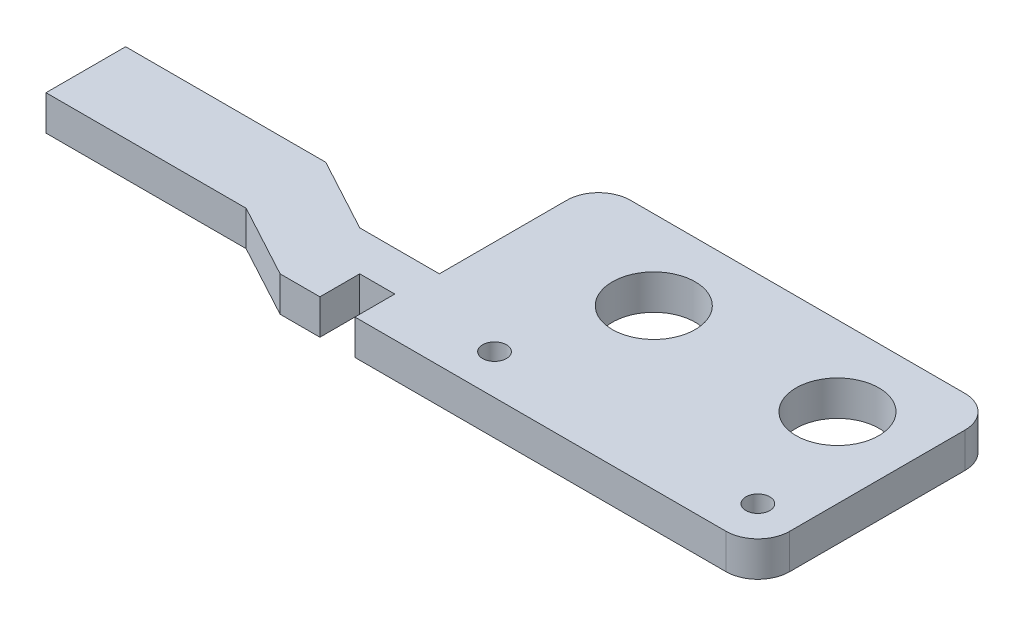
ISO-10303-21;
HEADER;
FILE_DESCRIPTION(('STEP AP214'),'2;1');
FILE_NAME('part.step','',(''),(''),'','','');
FILE_SCHEMA(('AUTOMOTIVE_DESIGN { 1 0 10303 214 1 1 1 1 }'));
ENDSEC;
DATA;
#1=APPLICATION_CONTEXT('core data for automotive mechanical design processes');
#2=APPLICATION_PROTOCOL_DEFINITION('international standard','automotive_design',2000,#1);
#3=PRODUCT_CONTEXT('',#1,'mechanical');
#4=PRODUCT('Part','Part','',(#3));
#5=PRODUCT_RELATED_PRODUCT_CATEGORY('part','',(#4));
#6=PRODUCT_DEFINITION_FORMATION('','',#4);
#7=PRODUCT_DEFINITION_CONTEXT('part definition',#1,'design');
#8=PRODUCT_DEFINITION('design','',#6,#7);
#9=PRODUCT_DEFINITION_SHAPE('','',#8);
#10=(LENGTH_UNIT() NAMED_UNIT(*) SI_UNIT(.MILLI.,.METRE.));
#11=(NAMED_UNIT(*) PLANE_ANGLE_UNIT() SI_UNIT($,.RADIAN.));
#12=(NAMED_UNIT(*) SI_UNIT($,.STERADIAN.) SOLID_ANGLE_UNIT());
#13=UNCERTAINTY_MEASURE_WITH_UNIT(LENGTH_MEASURE(1.E-05),#10,'distance_accuracy_value','');
#14=(GEOMETRIC_REPRESENTATION_CONTEXT(3) GLOBAL_UNCERTAINTY_ASSIGNED_CONTEXT((#13)) GLOBAL_UNIT_ASSIGNED_CONTEXT((#10,
#11,#12)) REPRESENTATION_CONTEXT('',''));
#15=CARTESIAN_POINT('',(0.,0.,0.));
#16=DIRECTION('',(0.,0.,1.));
#17=DIRECTION('',(1.,0.,0.));
#18=AXIS2_PLACEMENT_3D('',#15,#16,#17);
#19=CARTESIAN_POINT('',(59.944,2.794,-19.05));
#20=DIRECTION('',(-1.,0.,0.));
#21=DIRECTION('',(0.,0.,1.));
#22=AXIS2_PLACEMENT_3D('',#19,#20,#21);
#23=PLANE('',#22);
#24=DIRECTION('',(0.,0.,-1.));
#25=VECTOR('',#24,1.);
#26=CARTESIAN_POINT('',(59.944,0.,-19.05));
#27=LINE('',#26,#25);
#28=CARTESIAN_POINT('',(59.944,0.,-2.54000000000001));
#29=VERTEX_POINT('',#28);
#30=CARTESIAN_POINT('',(59.944,0.,-16.51));
#31=VERTEX_POINT('',#30);
#32=EDGE_CURVE('E242',#29,#31,#27,.T.);
#33=ORIENTED_EDGE('',*,*,#32,.T.);
#34=DIRECTION('',(0.,-1.,0.));
#35=VECTOR('',#34,1.);
#36=CARTESIAN_POINT('',(59.944,2.794,-16.51));
#37=LINE('',#36,#35);
#38=CARTESIAN_POINT('',(59.944,2.794,-16.51));
#39=VERTEX_POINT('',#38);
#40=EDGE_CURVE('E46',#31,#39,#37,.F.);
#41=ORIENTED_EDGE('',*,*,#40,.T.);
#42=DIRECTION('',(0.,0.,-1.));
#43=VECTOR('',#42,1.);
#44=CARTESIAN_POINT('',(59.944,2.794,-19.05));
#45=LINE('',#44,#43);
#46=CARTESIAN_POINT('',(59.944,2.794,-2.54000000000001));
#47=VERTEX_POINT('',#46);
#48=EDGE_CURVE('E271',#47,#39,#45,.T.);
#49=ORIENTED_EDGE('',*,*,#48,.F.);
#50=DIRECTION('',(0.,-1.,0.));
#51=VECTOR('',#50,1.);
#52=CARTESIAN_POINT('',(59.944,2.794,-2.54));
#53=LINE('',#52,#51);
#54=EDGE_CURVE('E319',#47,#29,#53,.T.);
#55=ORIENTED_EDGE('',*,*,#54,.T.);
#56=EDGE_LOOP('',(#33,#41,#49,#55));
#57=FACE_BOUND('',#56,.T.);
#58=ADVANCED_FACE('F38',(#57),#23,.F.);
#59=CARTESIAN_POINT('',(28.194,2.794,-19.05));
#60=DIRECTION('',(0.,0.,1.));
#61=DIRECTION('',(1.,0.,0.));
#62=AXIS2_PLACEMENT_3D('',#59,#60,#61);
#63=PLANE('',#62);
#64=DIRECTION('',(-1.,0.,0.));
#65=VECTOR('',#64,1.);
#66=CARTESIAN_POINT('',(28.194,0.,-19.05));
#67=LINE('',#66,#65);
#68=CARTESIAN_POINT('',(57.404,0.,-19.05));
#69=VERTEX_POINT('',#68);
#70=CARTESIAN_POINT('',(30.734,0.,-19.05));
#71=VERTEX_POINT('',#70);
#72=EDGE_CURVE('E244',#69,#71,#67,.T.);
#73=ORIENTED_EDGE('',*,*,#72,.T.);
#74=DIRECTION('',(0.,-1.,0.));
#75=VECTOR('',#74,1.);
#76=CARTESIAN_POINT('',(30.734,2.794,-19.05));
#77=LINE('',#76,#75);
#78=CARTESIAN_POINT('',(30.734,2.794,-19.05));
#79=VERTEX_POINT('',#78);
#80=EDGE_CURVE('E309',#71,#79,#77,.F.);
#81=ORIENTED_EDGE('',*,*,#80,.T.);
#82=DIRECTION('',(-1.,0.,0.));
#83=VECTOR('',#82,1.);
#84=CARTESIAN_POINT('',(28.194,2.794,-19.05));
#85=LINE('',#84,#83);
#86=CARTESIAN_POINT('',(57.404,2.794,-19.05));
#87=VERTEX_POINT('',#86);
#88=EDGE_CURVE('E170',#87,#79,#85,.T.);
#89=ORIENTED_EDGE('',*,*,#88,.F.);
#90=DIRECTION('',(0.,-1.,0.));
#91=VECTOR('',#90,1.);
#92=CARTESIAN_POINT('',(57.404,2.794,-19.05));
#93=LINE('',#92,#91);
#94=EDGE_CURVE('E306',#87,#69,#93,.T.);
#95=ORIENTED_EDGE('',*,*,#94,.T.);
#96=EDGE_LOOP('',(#73,#81,#89,#95));
#97=FACE_BOUND('',#96,.T.);
#98=ADVANCED_FACE('F335',(#97),#63,.F.);
#99=CARTESIAN_POINT('',(28.194,2.794,-6.34999999999999));
#100=DIRECTION('',(1.,0.,0.));
#101=DIRECTION('',(0.,0.,-1.));
#102=AXIS2_PLACEMENT_3D('',#99,#100,#101);
#103=PLANE('',#102);
#104=DIRECTION('',(0.,0.,1.));
#105=VECTOR('',#104,1.);
#106=CARTESIAN_POINT('',(28.194,2.794,-6.34999999999999));
#107=LINE('',#106,#105);
#108=CARTESIAN_POINT('',(28.194,2.794,-16.51));
#109=VERTEX_POINT('',#108);
#110=CARTESIAN_POINT('',(28.194,2.794,-6.34999999999999));
#111=VERTEX_POINT('',#110);
#112=EDGE_CURVE('E157',#109,#111,#107,.T.);
#113=ORIENTED_EDGE('',*,*,#112,.F.);
#114=DIRECTION('',(0.,-1.,0.));
#115=VECTOR('',#114,1.);
#116=CARTESIAN_POINT('',(28.194,2.794,-16.51));
#117=LINE('',#116,#115);
#118=CARTESIAN_POINT('',(28.194,0.,-16.51));
#119=VERTEX_POINT('',#118);
#120=EDGE_CURVE('E179',#109,#119,#117,.T.);
#121=ORIENTED_EDGE('',*,*,#120,.T.);
#122=DIRECTION('',(0.,0.,1.));
#123=VECTOR('',#122,1.);
#124=CARTESIAN_POINT('',(28.194,0.,-6.34999999999999));
#125=LINE('',#124,#123);
#126=CARTESIAN_POINT('',(28.194,0.,-6.34999999999999));
#127=VERTEX_POINT('',#126);
#128=EDGE_CURVE('E176',#119,#127,#125,.T.);
#129=ORIENTED_EDGE('',*,*,#128,.T.);
#130=DIRECTION('',(0.,-1.,0.));
#131=VECTOR('',#130,1.);
#132=CARTESIAN_POINT('',(28.194,2.794,-6.34999999999999));
#133=LINE('',#132,#131);
#134=EDGE_CURVE('E173',#111,#127,#133,.T.);
#135=ORIENTED_EDGE('',*,*,#134,.F.);
#136=EDGE_LOOP('',(#113,#121,#129,#135));
#137=FACE_BOUND('',#136,.T.);
#138=ADVANCED_FACE('F174',(#137),#103,.F.);
#139=CARTESIAN_POINT('',(21.844,2.794,-6.34999999999999));
#140=DIRECTION('',(0.,0.,1.));
#141=DIRECTION('',(1.,0.,0.));
#142=AXIS2_PLACEMENT_3D('',#139,#140,#141);
#143=PLANE('',#142);
#144=DIRECTION('',(-1.,0.,0.));
#145=VECTOR('',#144,1.);
#146=CARTESIAN_POINT('',(21.844,0.,-6.34999999999999));
#147=LINE('',#146,#145);
#148=CARTESIAN_POINT('',(21.844,0.,-6.34999999999999));
#149=VERTEX_POINT('',#148);
#150=EDGE_CURVE('E249',#127,#149,#147,.T.);
#151=ORIENTED_EDGE('',*,*,#150,.T.);
#152=DIRECTION('',(0.,-1.,0.));
#153=VECTOR('',#152,1.);
#154=CARTESIAN_POINT('',(21.844,2.794,-6.34999999999999));
#155=LINE('',#154,#153);
#156=CARTESIAN_POINT('',(21.844,2.794,-6.34999999999999));
#157=VERTEX_POINT('',#156);
#158=EDGE_CURVE('E180',#157,#149,#155,.T.);
#159=ORIENTED_EDGE('',*,*,#158,.F.);
#160=DIRECTION('',(-1.,0.,0.));
#161=VECTOR('',#160,1.);
#162=CARTESIAN_POINT('',(21.844,2.794,-6.34999999999999));
#163=LINE('',#162,#161);
#164=EDGE_CURVE('E162',#111,#157,#163,.T.);
#165=ORIENTED_EDGE('',*,*,#164,.F.);
#166=ORIENTED_EDGE('',*,*,#134,.T.);
#167=EDGE_LOOP('',(#151,#159,#165,#166));
#168=FACE_BOUND('',#167,.T.);
#169=ADVANCED_FACE('F182',(#168),#143,.F.);
#170=CARTESIAN_POINT('',(21.844,2.794,-6.34999999999999));
#171=DIRECTION('',(-0.474973683481516,0.,0.88));
#172=DIRECTION('',(0.88,0.,0.474973683481516));
#173=AXIS2_PLACEMENT_3D('',#170,#171,#172);
#174=PLANE('',#173);
#175=DIRECTION('',(-0.88,0.,-0.474973683481516));
#176=VECTOR('',#175,1.);
#177=CARTESIAN_POINT('',(21.844,0.,-6.34999999999999));
#178=LINE('',#177,#176);
#179=CARTESIAN_POINT('',(15.9615688313504,0.,-9.52499999999999));
#180=VERTEX_POINT('',#179);
#181=EDGE_CURVE('E251',#149,#180,#178,.T.);
#182=ORIENTED_EDGE('',*,*,#181,.T.);
#183=DIRECTION('',(0.,-1.,0.));
#184=VECTOR('',#183,1.);
#185=CARTESIAN_POINT('',(15.9615688313504,2.794,-9.52499999999999));
#186=LINE('',#185,#184);
#187=CARTESIAN_POINT('',(15.9615688313504,2.794,-9.52499999999999));
#188=VERTEX_POINT('',#187);
#189=EDGE_CURVE('E295',#188,#180,#186,.T.);
#190=ORIENTED_EDGE('',*,*,#189,.F.);
#191=DIRECTION('',(-0.88,0.,-0.474973683481516));
#192=VECTOR('',#191,1.);
#193=CARTESIAN_POINT('',(21.844,2.794,-6.34999999999999));
#194=LINE('',#193,#192);
#195=EDGE_CURVE('E186',#157,#188,#194,.T.);
#196=ORIENTED_EDGE('',*,*,#195,.F.);
#197=ORIENTED_EDGE('',*,*,#158,.T.);
#198=EDGE_LOOP('',(#182,#190,#196,#197));
#199=FACE_BOUND('',#198,.T.);
#200=ADVANCED_FACE('F469',(#199),#174,.F.);
#201=CARTESIAN_POINT('',(0.,2.794,-9.52499999999999));
#202=DIRECTION('',(0.,0.,1.));
#203=DIRECTION('',(1.,0.,0.));
#204=AXIS2_PLACEMENT_3D('',#201,#202,#203);
#205=PLANE('',#204);
#206=DIRECTION('',(-1.,0.,0.));
#207=VECTOR('',#206,1.);
#208=CARTESIAN_POINT('',(0.,0.,-9.52499999999999));
#209=LINE('',#208,#207);
#210=CARTESIAN_POINT('',(0.,0.,-9.52499999999999));
#211=VERTEX_POINT('',#210);
#212=EDGE_CURVE('E253',#180,#211,#209,.T.);
#213=ORIENTED_EDGE('',*,*,#212,.T.);
#214=DIRECTION('',(0.,-1.,0.));
#215=VECTOR('',#214,1.);
#216=CARTESIAN_POINT('',(0.,2.794,-9.52499999999999));
#217=LINE('',#216,#215);
#218=CARTESIAN_POINT('',(0.,2.794,-9.52499999999999));
#219=VERTEX_POINT('',#218);
#220=EDGE_CURVE('E292',#219,#211,#217,.T.);
#221=ORIENTED_EDGE('',*,*,#220,.F.);
#222=DIRECTION('',(-1.,0.,0.));
#223=VECTOR('',#222,1.);
#224=CARTESIAN_POINT('',(0.,2.794,-9.52499999999999));
#225=LINE('',#224,#223);
#226=EDGE_CURVE('E189',#188,#219,#225,.T.);
#227=ORIENTED_EDGE('',*,*,#226,.F.);
#228=ORIENTED_EDGE('',*,*,#189,.T.);
#229=EDGE_LOOP('',(#213,#221,#227,#228));
#230=FACE_BOUND('',#229,.T.);
#231=ADVANCED_FACE('F466',(#230),#205,.F.);
#232=CARTESIAN_POINT('',(0.,2.794,-9.52499999999999));
#233=DIRECTION('',(1.,0.,0.));
#234=DIRECTION('',(0.,0.,-1.));
#235=AXIS2_PLACEMENT_3D('',#232,#233,#234);
#236=PLANE('',#235);
#237=DIRECTION('',(0.,0.,1.));
#238=VECTOR('',#237,1.);
#239=CARTESIAN_POINT('',(0.,0.,-9.52499999999999));
#240=LINE('',#239,#238);
#241=CARTESIAN_POINT('',(0.,0.,-3.17499999999999));
#242=VERTEX_POINT('',#241);
#243=EDGE_CURVE('E255',#211,#242,#240,.T.);
#244=ORIENTED_EDGE('',*,*,#243,.T.);
#245=DIRECTION('',(0.,-1.,0.));
#246=VECTOR('',#245,1.);
#247=CARTESIAN_POINT('',(0.,2.794,-3.17499999999999));
#248=LINE('',#247,#246);
#249=CARTESIAN_POINT('',(0.,2.794,-3.17499999999999));
#250=VERTEX_POINT('',#249);
#251=EDGE_CURVE('E289',#250,#242,#248,.T.);
#252=ORIENTED_EDGE('',*,*,#251,.F.);
#253=DIRECTION('',(0.,0.,1.));
#254=VECTOR('',#253,1.);
#255=CARTESIAN_POINT('',(0.,2.794,-9.52499999999999));
#256=LINE('',#255,#254);
#257=EDGE_CURVE('E206',#219,#250,#256,.T.);
#258=ORIENTED_EDGE('',*,*,#257,.F.);
#259=ORIENTED_EDGE('',*,*,#220,.T.);
#260=EDGE_LOOP('',(#244,#252,#258,#259));
#261=FACE_BOUND('',#260,.T.);
#262=ADVANCED_FACE('F461',(#261),#236,.F.);
#263=CARTESIAN_POINT('',(0.,2.794,-3.17499999999999));
#264=DIRECTION('',(0.,0.,-1.));
#265=DIRECTION('',(-1.,0.,0.));
#266=AXIS2_PLACEMENT_3D('',#263,#264,#265);
#267=PLANE('',#266);
#268=DIRECTION('',(1.,0.,0.));
#269=VECTOR('',#268,1.);
#270=CARTESIAN_POINT('',(0.,0.,-3.17499999999999));
#271=LINE('',#270,#269);
#272=CARTESIAN_POINT('',(15.9615688313504,0.,-3.17499999999999));
#273=VERTEX_POINT('',#272);
#274=EDGE_CURVE('E257',#242,#273,#271,.T.);
#275=ORIENTED_EDGE('',*,*,#274,.T.);
#276=DIRECTION('',(0.,-1.,0.));
#277=VECTOR('',#276,1.);
#278=CARTESIAN_POINT('',(15.9615688313504,2.794,-3.17499999999999));
#279=LINE('',#278,#277);
#280=CARTESIAN_POINT('',(15.9615688313504,2.794,-3.17499999999999));
#281=VERTEX_POINT('',#280);
#282=EDGE_CURVE('E286',#281,#273,#279,.T.);
#283=ORIENTED_EDGE('',*,*,#282,.F.);
#284=DIRECTION('',(1.,0.,0.));
#285=VECTOR('',#284,1.);
#286=CARTESIAN_POINT('',(0.,2.794,-3.17499999999999));
#287=LINE('',#286,#285);
#288=EDGE_CURVE('E210',#250,#281,#287,.T.);
#289=ORIENTED_EDGE('',*,*,#288,.F.);
#290=ORIENTED_EDGE('',*,*,#251,.T.);
#291=EDGE_LOOP('',(#275,#283,#289,#290));
#292=FACE_BOUND('',#291,.T.);
#293=ADVANCED_FACE('F455',(#292),#267,.F.);
#294=CARTESIAN_POINT('',(15.9615688313504,2.794,-3.17499999999999));
#295=DIRECTION('',(0.474973683481516,0.,-0.88));
#296=DIRECTION('',(-0.88,0.,-0.474973683481516));
#297=AXIS2_PLACEMENT_3D('',#294,#295,#296);
#298=PLANE('',#297);
#299=DIRECTION('',(0.88,0.,0.474973683481516));
#300=VECTOR('',#299,1.);
#301=CARTESIAN_POINT('',(15.9615688313504,0.,-3.17499999999999));
#302=LINE('',#301,#300);
#303=CARTESIAN_POINT('',(21.844,0.,0.));
#304=VERTEX_POINT('',#303);
#305=EDGE_CURVE('E259',#273,#304,#302,.T.);
#306=ORIENTED_EDGE('',*,*,#305,.T.);
#307=DIRECTION('',(0.,-1.,0.));
#308=VECTOR('',#307,1.);
#309=CARTESIAN_POINT('',(21.844,2.794,0.));
#310=LINE('',#309,#308);
#311=CARTESIAN_POINT('',(21.844,2.794,0.));
#312=VERTEX_POINT('',#311);
#313=EDGE_CURVE('E283',#312,#304,#310,.T.);
#314=ORIENTED_EDGE('',*,*,#313,.F.);
#315=DIRECTION('',(0.88,0.,0.474973683481516));
#316=VECTOR('',#315,1.);
#317=CARTESIAN_POINT('',(15.9615688313504,2.794,-3.17499999999999));
#318=LINE('',#317,#316);
#319=EDGE_CURVE('E214',#281,#312,#318,.T.);
#320=ORIENTED_EDGE('',*,*,#319,.F.);
#321=ORIENTED_EDGE('',*,*,#282,.T.);
#322=EDGE_LOOP('',(#306,#314,#320,#321));
#323=FACE_BOUND('',#322,.T.);
#324=ADVANCED_FACE('F451',(#323),#298,.F.);
#325=CARTESIAN_POINT('',(25.019,2.794,0.));
#326=DIRECTION('',(0.,0.,-1.));
#327=DIRECTION('',(-1.,0.,0.));
#328=AXIS2_PLACEMENT_3D('',#325,#326,#327);
#329=PLANE('',#328);
#330=DIRECTION('',(1.,0.,0.));
#331=VECTOR('',#330,1.);
#332=CARTESIAN_POINT('',(25.019,0.,0.));
#333=LINE('',#332,#331);
#334=CARTESIAN_POINT('',(25.019,0.,0.));
#335=VERTEX_POINT('',#334);
#336=EDGE_CURVE('E261',#304,#335,#333,.T.);
#337=ORIENTED_EDGE('',*,*,#336,.T.);
#338=DIRECTION('',(0.,-1.,0.));
#339=VECTOR('',#338,1.);
#340=CARTESIAN_POINT('',(25.019,2.794,0.));
#341=LINE('',#340,#339);
#342=CARTESIAN_POINT('',(25.019,2.794,0.));
#343=VERTEX_POINT('',#342);
#344=EDGE_CURVE('E280',#343,#335,#341,.T.);
#345=ORIENTED_EDGE('',*,*,#344,.F.);
#346=DIRECTION('',(1.,0.,0.));
#347=VECTOR('',#346,1.);
#348=CARTESIAN_POINT('',(25.019,2.794,0.));
#349=LINE('',#348,#347);
#350=EDGE_CURVE('E222',#312,#343,#349,.T.);
#351=ORIENTED_EDGE('',*,*,#350,.F.);
#352=ORIENTED_EDGE('',*,*,#313,.T.);
#353=EDGE_LOOP('',(#337,#345,#351,#352));
#354=FACE_BOUND('',#353,.T.);
#355=ADVANCED_FACE('F446',(#354),#329,.F.);
#356=CARTESIAN_POINT('',(25.019,2.794,0.));
#357=DIRECTION('',(-1.,0.,0.));
#358=DIRECTION('',(0.,0.,1.));
#359=AXIS2_PLACEMENT_3D('',#356,#357,#358);
#360=PLANE('',#359);
#361=DIRECTION('',(0.,0.,-1.));
#362=VECTOR('',#361,1.);
#363=CARTESIAN_POINT('',(25.019,0.,0.));
#364=LINE('',#363,#362);
#365=CARTESIAN_POINT('',(25.019,0.,-3.17499999999999));
#366=VERTEX_POINT('',#365);
#367=EDGE_CURVE('E263',#335,#366,#364,.T.);
#368=ORIENTED_EDGE('',*,*,#367,.T.);
#369=DIRECTION('',(0.,-1.,0.));
#370=VECTOR('',#369,1.);
#371=CARTESIAN_POINT('',(25.019,2.794,-3.17499999999999));
#372=LINE('',#371,#370);
#373=CARTESIAN_POINT('',(25.019,2.794,-3.17499999999999));
#374=VERTEX_POINT('',#373);
#375=EDGE_CURVE('E277',#374,#366,#372,.T.);
#376=ORIENTED_EDGE('',*,*,#375,.F.);
#377=DIRECTION('',(0.,0.,-1.));
#378=VECTOR('',#377,1.);
#379=CARTESIAN_POINT('',(25.019,2.794,0.));
#380=LINE('',#379,#378);
#381=EDGE_CURVE('E225',#343,#374,#380,.T.);
#382=ORIENTED_EDGE('',*,*,#381,.F.);
#383=ORIENTED_EDGE('',*,*,#344,.T.);
#384=EDGE_LOOP('',(#368,#376,#382,#383));
#385=FACE_BOUND('',#384,.T.);
#386=ADVANCED_FACE('F440',(#385),#360,.F.);
#387=CARTESIAN_POINT('',(25.019,2.794,-3.17499999999999));
#388=DIRECTION('',(0.,0.,-1.));
#389=DIRECTION('',(-1.,0.,0.));
#390=AXIS2_PLACEMENT_3D('',#387,#388,#389);
#391=PLANE('',#390);
#392=DIRECTION('',(1.,0.,0.));
#393=VECTOR('',#392,1.);
#394=CARTESIAN_POINT('',(25.019,0.,-3.17499999999999));
#395=LINE('',#394,#393);
#396=CARTESIAN_POINT('',(27.813,0.,-3.175));
#397=VERTEX_POINT('',#396);
#398=EDGE_CURVE('E265',#366,#397,#395,.T.);
#399=ORIENTED_EDGE('',*,*,#398,.T.);
#400=DIRECTION('',(0.,-1.,0.));
#401=VECTOR('',#400,1.);
#402=CARTESIAN_POINT('',(27.813,2.794,-3.175));
#403=LINE('',#402,#401);
#404=CARTESIAN_POINT('',(27.813,2.794,-3.175));
#405=VERTEX_POINT('',#404);
#406=EDGE_CURVE('E274',#405,#397,#403,.T.);
#407=ORIENTED_EDGE('',*,*,#406,.F.);
#408=DIRECTION('',(1.,0.,0.));
#409=VECTOR('',#408,1.);
#410=CARTESIAN_POINT('',(25.019,2.794,-3.17499999999999));
#411=LINE('',#410,#409);
#412=EDGE_CURVE('E229',#374,#405,#411,.T.);
#413=ORIENTED_EDGE('',*,*,#412,.F.);
#414=ORIENTED_EDGE('',*,*,#375,.T.);
#415=EDGE_LOOP('',(#399,#407,#413,#414));
#416=FACE_BOUND('',#415,.T.);
#417=ADVANCED_FACE('F436',(#416),#391,.F.);
#418=CARTESIAN_POINT('',(27.813,2.794,-3.175));
#419=DIRECTION('',(1.,0.,0.));
#420=DIRECTION('',(0.,0.,-1.));
#421=AXIS2_PLACEMENT_3D('',#418,#419,#420);
#422=PLANE('',#421);
#423=DIRECTION('',(0.,0.,1.));
#424=VECTOR('',#423,1.);
#425=CARTESIAN_POINT('',(27.813,0.,-3.175));
#426=LINE('',#425,#424);
#427=CARTESIAN_POINT('',(27.813,0.,0.));
#428=VERTEX_POINT('',#427);
#429=EDGE_CURVE('E267',#397,#428,#426,.T.);
#430=ORIENTED_EDGE('',*,*,#429,.T.);
#431=DIRECTION('',(0.,-1.,0.));
#432=VECTOR('',#431,1.);
#433=CARTESIAN_POINT('',(27.813,2.794,0.));
#434=LINE('',#433,#432);
#435=CARTESIAN_POINT('',(27.813,2.794,0.));
#436=VERTEX_POINT('',#435);
#437=EDGE_CURVE('E241',#436,#428,#434,.T.);
#438=ORIENTED_EDGE('',*,*,#437,.F.);
#439=DIRECTION('',(0.,0.,1.));
#440=VECTOR('',#439,1.);
#441=CARTESIAN_POINT('',(27.813,2.794,-3.175));
#442=LINE('',#441,#440);
#443=EDGE_CURVE('E233',#405,#436,#442,.T.);
#444=ORIENTED_EDGE('',*,*,#443,.F.);
#445=ORIENTED_EDGE('',*,*,#406,.T.);
#446=EDGE_LOOP('',(#430,#438,#444,#445));
#447=FACE_BOUND('',#446,.T.);
#448=ADVANCED_FACE('F432',(#447),#422,.F.);
#449=CARTESIAN_POINT('',(59.944,2.794,0.));
#450=DIRECTION('',(0.,0.,-1.));
#451=DIRECTION('',(-1.,0.,0.));
#452=AXIS2_PLACEMENT_3D('',#449,#450,#451);
#453=PLANE('',#452);
#454=DIRECTION('',(1.,0.,0.));
#455=VECTOR('',#454,1.);
#456=CARTESIAN_POINT('',(59.944,0.,0.));
#457=LINE('',#456,#455);
#458=CARTESIAN_POINT('',(57.404,0.,0.));
#459=VERTEX_POINT('',#458);
#460=EDGE_CURVE('E269',#428,#459,#457,.T.);
#461=ORIENTED_EDGE('',*,*,#460,.T.);
#462=DIRECTION('',(0.,-1.,0.));
#463=VECTOR('',#462,1.);
#464=CARTESIAN_POINT('',(57.404,2.794,0.));
#465=LINE('',#464,#463);
#466=CARTESIAN_POINT('',(57.404,2.794,0.));
#467=VERTEX_POINT('',#466);
#468=EDGE_CURVE('E12',#459,#467,#465,.F.);
#469=ORIENTED_EDGE('',*,*,#468,.T.);
#470=DIRECTION('',(1.,0.,0.));
#471=VECTOR('',#470,1.);
#472=CARTESIAN_POINT('',(59.944,2.794,0.));
#473=LINE('',#472,#471);
#474=EDGE_CURVE('E237',#436,#467,#473,.T.);
#475=ORIENTED_EDGE('',*,*,#474,.F.);
#476=ORIENTED_EDGE('',*,*,#437,.T.);
#477=EDGE_LOOP('',(#461,#469,#475,#476));
#478=FACE_BOUND('',#477,.T.);
#479=ADVANCED_FACE('F389',(#478),#453,.F.);
#480=CARTESIAN_POINT('',(0.,2.794,0.));
#481=DIRECTION('',(0.,-1.,0.));
#482=DIRECTION('',(0.,0.,-1.));
#483=AXIS2_PLACEMENT_3D('',#480,#481,#482);
#484=PLANE('',#483);
#485=CARTESIAN_POINT('',(38.944,2.794,-12.7));
#486=DIRECTION('',(0.,1.,0.));
#487=DIRECTION('',(0.,0.,1.));
#488=AXIS2_PLACEMENT_3D('',#485,#486,#487);
#489=CIRCLE('',#488,3.302);
#490=CARTESIAN_POINT('',(38.944,2.794,-9.398));
#491=VERTEX_POINT('',#490);
#492=EDGE_CURVE('E369',#491,#491,#489,.T.);
#493=ORIENTED_EDGE('',*,*,#492,.F.);
#494=EDGE_LOOP('',(#493));
#495=FACE_BOUND('',#494,.T.);
#496=CARTESIAN_POINT('',(53.594,2.794,-12.7));
#497=DIRECTION('',(0.,1.,0.));
#498=DIRECTION('',(0.,0.,1.));
#499=AXIS2_PLACEMENT_3D('',#496,#497,#498);
#500=CIRCLE('',#499,3.302);
#501=CARTESIAN_POINT('',(53.594,2.794,-9.39800000000001));
#502=VERTEX_POINT('',#501);
#503=EDGE_CURVE('E361',#502,#502,#500,.T.);
#504=ORIENTED_EDGE('',*,*,#503,.F.);
#505=EDGE_LOOP('',(#504));
#506=FACE_BOUND('',#505,.T.);
#507=CARTESIAN_POINT('',(35.769,2.794,-3.17499999999999));
#508=DIRECTION('',(0.,1.,0.));
#509=DIRECTION('',(0.,0.,1.));
#510=AXIS2_PLACEMENT_3D('',#507,#508,#509);
#511=CIRCLE('',#510,0.952500000000004);
#512=CARTESIAN_POINT('',(35.769,2.794,-2.22249999999999));
#513=VERTEX_POINT('',#512);
#514=EDGE_CURVE('E353',#513,#513,#511,.T.);
#515=ORIENTED_EDGE('',*,*,#514,.F.);
#516=EDGE_LOOP('',(#515));
#517=FACE_BOUND('',#516,.T.);
#518=CARTESIAN_POINT('',(56.769,2.794,-3.17499999999999));
#519=DIRECTION('',(0.,1.,0.));
#520=DIRECTION('',(0.,0.,1.));
#521=AXIS2_PLACEMENT_3D('',#518,#519,#520);
#522=CIRCLE('',#521,0.952500000000004);
#523=CARTESIAN_POINT('',(56.769,2.794,-2.22249999999999));
#524=VERTEX_POINT('',#523);
#525=EDGE_CURVE('E347',#524,#524,#522,.T.);
#526=ORIENTED_EDGE('',*,*,#525,.F.);
#527=EDGE_LOOP('',(#526));
#528=FACE_BOUND('',#527,.T.);
#529=ORIENTED_EDGE('',*,*,#88,.T.);
#530=CARTESIAN_POINT('',(30.734,2.794,-16.51));
#531=DIRECTION('',(0.,-1.,0.));
#532=DIRECTION('',(0.,0.,-1.));
#533=AXIS2_PLACEMENT_3D('',#530,#531,#532);
#534=CIRCLE('',#533,2.54);
#535=EDGE_CURVE('E165',#79,#109,#534,.F.);
#536=ORIENTED_EDGE('',*,*,#535,.T.);
#537=ORIENTED_EDGE('',*,*,#112,.T.);
#538=ORIENTED_EDGE('',*,*,#164,.T.);
#539=ORIENTED_EDGE('',*,*,#195,.T.);
#540=ORIENTED_EDGE('',*,*,#226,.T.);
#541=ORIENTED_EDGE('',*,*,#257,.T.);
#542=ORIENTED_EDGE('',*,*,#288,.T.);
#543=ORIENTED_EDGE('',*,*,#319,.T.);
#544=ORIENTED_EDGE('',*,*,#350,.T.);
#545=ORIENTED_EDGE('',*,*,#381,.T.);
#546=ORIENTED_EDGE('',*,*,#412,.T.);
#547=ORIENTED_EDGE('',*,*,#443,.T.);
#548=ORIENTED_EDGE('',*,*,#474,.T.);
#549=CARTESIAN_POINT('',(57.404,2.794,-2.54));
#550=DIRECTION('',(0.,-1.,0.));
#551=DIRECTION('',(0.,0.,-1.));
#552=AXIS2_PLACEMENT_3D('',#549,#550,#551);
#553=CIRCLE('',#552,2.54);
#554=EDGE_CURVE('E311',#467,#47,#553,.F.);
#555=ORIENTED_EDGE('',*,*,#554,.T.);
#556=ORIENTED_EDGE('',*,*,#48,.T.);
#557=CARTESIAN_POINT('',(57.404,2.794,-16.51));
#558=DIRECTION('',(0.,-1.,0.));
#559=DIRECTION('',(0.,0.,-1.));
#560=AXIS2_PLACEMENT_3D('',#557,#558,#559);
#561=CIRCLE('',#560,2.54);
#562=EDGE_CURVE('E314',#39,#87,#561,.F.);
#563=ORIENTED_EDGE('',*,*,#562,.T.);
#564=EDGE_LOOP('',(#529,#536,#537,#538,#539,#540,#541,#542,#543,#544,#545,#546,#547,#548,#555,
#556,#563));
#565=FACE_BOUND('',#564,.T.);
#566=ADVANCED_FACE('F160',(#495,#506,#517,#528,#565),#484,.F.);
#567=CARTESIAN_POINT('',(0.,0.,0.));
#568=DIRECTION('',(0.,-1.,0.));
#569=DIRECTION('',(0.,0.,-1.));
#570=AXIS2_PLACEMENT_3D('',#567,#568,#569);
#571=PLANE('',#570);
#572=CARTESIAN_POINT('',(38.944,0.,-12.7));
#573=DIRECTION('',(0.,1.,0.));
#574=DIRECTION('',(0.,0.,1.));
#575=AXIS2_PLACEMENT_3D('',#572,#573,#574);
#576=CIRCLE('',#575,3.302);
#577=CARTESIAN_POINT('',(38.944,0.,-9.398));
#578=VERTEX_POINT('',#577);
#579=EDGE_CURVE('E366',#578,#578,#576,.T.);
#580=ORIENTED_EDGE('',*,*,#579,.T.);
#581=EDGE_LOOP('',(#580));
#582=FACE_BOUND('',#581,.T.);
#583=CARTESIAN_POINT('',(53.594,0.,-12.7));
#584=DIRECTION('',(0.,1.,0.));
#585=DIRECTION('',(0.,0.,1.));
#586=AXIS2_PLACEMENT_3D('',#583,#584,#585);
#587=CIRCLE('',#586,3.302);
#588=CARTESIAN_POINT('',(53.594,0.,-9.39800000000001));
#589=VERTEX_POINT('',#588);
#590=EDGE_CURVE('E358',#589,#589,#587,.T.);
#591=ORIENTED_EDGE('',*,*,#590,.T.);
#592=EDGE_LOOP('',(#591));
#593=FACE_BOUND('',#592,.T.);
#594=CARTESIAN_POINT('',(35.769,0.,-3.17499999999999));
#595=DIRECTION('',(0.,1.,0.));
#596=DIRECTION('',(0.,0.,1.));
#597=AXIS2_PLACEMENT_3D('',#594,#595,#596);
#598=CIRCLE('',#597,0.952500000000004);
#599=CARTESIAN_POINT('',(35.769,0.,-2.22249999999999));
#600=VERTEX_POINT('',#599);
#601=EDGE_CURVE('E351',#600,#600,#598,.T.);
#602=ORIENTED_EDGE('',*,*,#601,.T.);
#603=EDGE_LOOP('',(#602));
#604=FACE_BOUND('',#603,.T.);
#605=CARTESIAN_POINT('',(56.769,0.,-3.17499999999999));
#606=DIRECTION('',(0.,1.,0.));
#607=DIRECTION('',(0.,0.,1.));
#608=AXIS2_PLACEMENT_3D('',#605,#606,#607);
#609=CIRCLE('',#608,0.952500000000004);
#610=CARTESIAN_POINT('',(56.769,0.,-2.22249999999999));
#611=VERTEX_POINT('',#610);
#612=EDGE_CURVE('E245',#611,#611,#609,.T.);
#613=ORIENTED_EDGE('',*,*,#612,.T.);
#614=EDGE_LOOP('',(#613));
#615=FACE_BOUND('',#614,.T.);
#616=ORIENTED_EDGE('',*,*,#128,.F.);
#617=CARTESIAN_POINT('',(30.734,0.,-16.51));
#618=DIRECTION('',(0.,-1.,0.));
#619=DIRECTION('',(0.,0.,-1.));
#620=AXIS2_PLACEMENT_3D('',#617,#618,#619);
#621=CIRCLE('',#620,2.54);
#622=EDGE_CURVE('E304',#119,#71,#621,.T.);
#623=ORIENTED_EDGE('',*,*,#622,.T.);
#624=ORIENTED_EDGE('',*,*,#72,.F.);
#625=CARTESIAN_POINT('',(57.404,0.,-16.51));
#626=DIRECTION('',(0.,-1.,0.));
#627=DIRECTION('',(0.,0.,-1.));
#628=AXIS2_PLACEMENT_3D('',#625,#626,#627);
#629=CIRCLE('',#628,2.54);
#630=EDGE_CURVE('E302',#69,#31,#629,.T.);
#631=ORIENTED_EDGE('',*,*,#630,.T.);
#632=ORIENTED_EDGE('',*,*,#32,.F.);
#633=CARTESIAN_POINT('',(57.404,0.,-2.54));
#634=DIRECTION('',(0.,-1.,0.));
#635=DIRECTION('',(0.,0.,-1.));
#636=AXIS2_PLACEMENT_3D('',#633,#634,#635);
#637=CIRCLE('',#636,2.54);
#638=EDGE_CURVE('E300',#29,#459,#637,.T.);
#639=ORIENTED_EDGE('',*,*,#638,.T.);
#640=ORIENTED_EDGE('',*,*,#460,.F.);
#641=ORIENTED_EDGE('',*,*,#429,.F.);
#642=ORIENTED_EDGE('',*,*,#398,.F.);
#643=ORIENTED_EDGE('',*,*,#367,.F.);
#644=ORIENTED_EDGE('',*,*,#336,.F.);
#645=ORIENTED_EDGE('',*,*,#305,.F.);
#646=ORIENTED_EDGE('',*,*,#274,.F.);
#647=ORIENTED_EDGE('',*,*,#243,.F.);
#648=ORIENTED_EDGE('',*,*,#212,.F.);
#649=ORIENTED_EDGE('',*,*,#181,.F.);
#650=ORIENTED_EDGE('',*,*,#150,.F.);
#651=EDGE_LOOP('',(#616,#623,#624,#631,#632,#639,#640,#641,#642,#643,#644,#645,#646,#647,#648,
#649,#650));
#652=FACE_BOUND('',#651,.T.);
#653=ADVANCED_FACE('F326',(#582,#593,#604,#615,#652),#571,.T.);
#654=CARTESIAN_POINT('',(56.769,0.,-3.17499999999999));
#655=DIRECTION('',(0.,1.,0.));
#656=DIRECTION('',(0.,0.,1.));
#657=AXIS2_PLACEMENT_3D('',#654,#655,#656);
#658=CYLINDRICAL_SURFACE('',#657,0.952500000000004);
#659=ORIENTED_EDGE('',*,*,#612,.F.);
#660=EDGE_LOOP('',(#659));
#661=FACE_BOUND('',#660,.T.);
#662=ORIENTED_EDGE('',*,*,#525,.T.);
#663=EDGE_LOOP('',(#662));
#664=FACE_BOUND('',#663,.T.);
#665=ADVANCED_FACE('F397',(#661,#664),#658,.F.);
#666=CARTESIAN_POINT('',(35.769,0.,-3.17499999999999));
#667=DIRECTION('',(0.,1.,0.));
#668=DIRECTION('',(0.,0.,1.));
#669=AXIS2_PLACEMENT_3D('',#666,#667,#668);
#670=CYLINDRICAL_SURFACE('',#669,0.952500000000004);
#671=ORIENTED_EDGE('',*,*,#601,.F.);
#672=EDGE_LOOP('',(#671));
#673=FACE_BOUND('',#672,.T.);
#674=ORIENTED_EDGE('',*,*,#514,.T.);
#675=EDGE_LOOP('',(#674));
#676=FACE_BOUND('',#675,.T.);
#677=ADVANCED_FACE('F399',(#673,#676),#670,.F.);
#678=CARTESIAN_POINT('',(53.594,0.,-12.7));
#679=DIRECTION('',(0.,1.,0.));
#680=DIRECTION('',(0.,0.,1.));
#681=AXIS2_PLACEMENT_3D('',#678,#679,#680);
#682=CYLINDRICAL_SURFACE('',#681,3.302);
#683=ORIENTED_EDGE('',*,*,#590,.F.);
#684=EDGE_LOOP('',(#683));
#685=FACE_BOUND('',#684,.T.);
#686=ORIENTED_EDGE('',*,*,#503,.T.);
#687=EDGE_LOOP('',(#686));
#688=FACE_BOUND('',#687,.T.);
#689=ADVANCED_FACE('F383',(#685,#688),#682,.F.);
#690=CARTESIAN_POINT('',(38.944,0.,-12.7));
#691=DIRECTION('',(0.,1.,0.));
#692=DIRECTION('',(0.,0.,1.));
#693=AXIS2_PLACEMENT_3D('',#690,#691,#692);
#694=CYLINDRICAL_SURFACE('',#693,3.302);
#695=ORIENTED_EDGE('',*,*,#579,.F.);
#696=EDGE_LOOP('',(#695));
#697=FACE_BOUND('',#696,.T.);
#698=ORIENTED_EDGE('',*,*,#492,.T.);
#699=EDGE_LOOP('',(#698));
#700=FACE_BOUND('',#699,.T.);
#701=ADVANCED_FACE('F379',(#697,#700),#694,.F.);
#702=CARTESIAN_POINT('',(30.734,2.794,-16.51));
#703=DIRECTION('',(0.,-1.,0.));
#704=DIRECTION('',(0.,0.,-1.));
#705=AXIS2_PLACEMENT_3D('',#702,#703,#704);
#706=CYLINDRICAL_SURFACE('',#705,2.54);
#707=ORIENTED_EDGE('',*,*,#535,.F.);
#708=ORIENTED_EDGE('',*,*,#80,.F.);
#709=ORIENTED_EDGE('',*,*,#622,.F.);
#710=ORIENTED_EDGE('',*,*,#120,.F.);
#711=EDGE_LOOP('',(#707,#708,#709,#710));
#712=FACE_BOUND('',#711,.T.);
#713=ADVANCED_FACE('F382',(#712),#706,.T.);
#714=CARTESIAN_POINT('',(57.404,2.794,-16.51));
#715=DIRECTION('',(0.,-1.,0.));
#716=DIRECTION('',(0.,0.,-1.));
#717=AXIS2_PLACEMENT_3D('',#714,#715,#716);
#718=CYLINDRICAL_SURFACE('',#717,2.54);
#719=ORIENTED_EDGE('',*,*,#562,.F.);
#720=ORIENTED_EDGE('',*,*,#40,.F.);
#721=ORIENTED_EDGE('',*,*,#630,.F.);
#722=ORIENTED_EDGE('',*,*,#94,.F.);
#723=EDGE_LOOP('',(#719,#720,#721,#722));
#724=FACE_BOUND('',#723,.T.);
#725=ADVANCED_FACE('F332',(#724),#718,.T.);
#726=CARTESIAN_POINT('',(57.404,2.794,-2.54));
#727=DIRECTION('',(0.,-1.,0.));
#728=DIRECTION('',(0.,0.,-1.));
#729=AXIS2_PLACEMENT_3D('',#726,#727,#728);
#730=CYLINDRICAL_SURFACE('',#729,2.54);
#731=ORIENTED_EDGE('',*,*,#554,.F.);
#732=ORIENTED_EDGE('',*,*,#468,.F.);
#733=ORIENTED_EDGE('',*,*,#638,.F.);
#734=ORIENTED_EDGE('',*,*,#54,.F.);
#735=EDGE_LOOP('',(#731,#732,#733,#734));
#736=FACE_BOUND('',#735,.T.);
#737=ADVANCED_FACE('F40',(#736),#730,.T.);
#738=CLOSED_SHELL('',(#58,#98,#138,#169,#200,#231,#262,#293,#324,#355,#386,#417,#448,#479,#566,
#653,#665,#677,#689,#701,#713,#725,#737));
#739=MANIFOLD_SOLID_BREP('B2',#738);
#740=ADVANCED_BREP_SHAPE_REPRESENTATION('',(#18,#739),#14);
#741=SHAPE_DEFINITION_REPRESENTATION(#9,#740);
ENDSEC;
END-ISO-10303-21;
